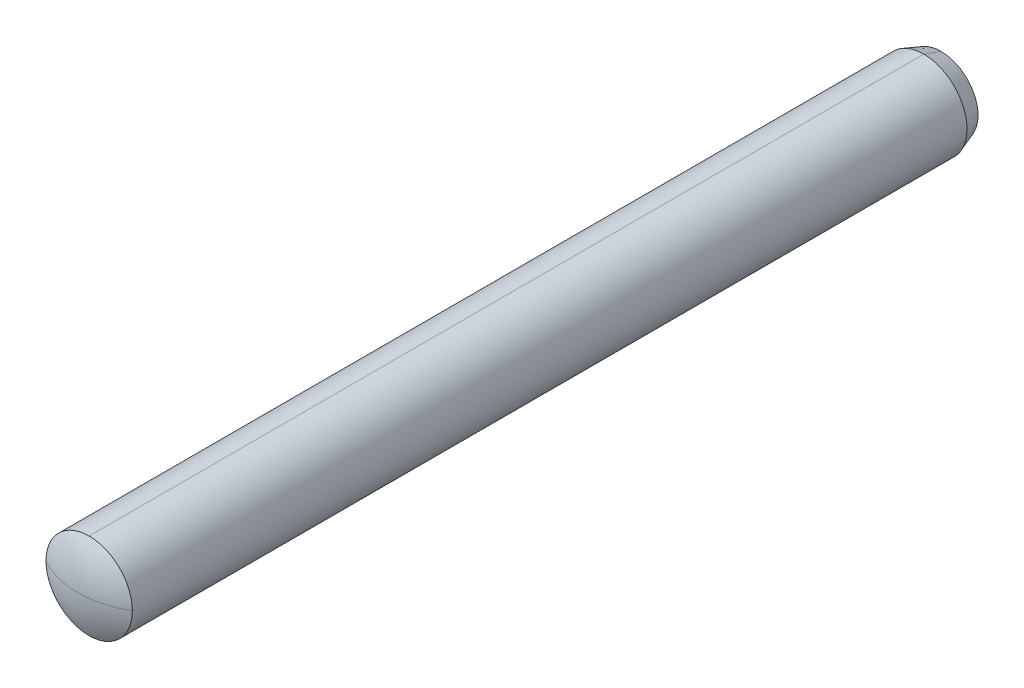
ISO-10303-21;
HEADER;
FILE_DESCRIPTION(('STEP AP214'),'2;1');
FILE_NAME('part.step','',(''),(''),'','','');
FILE_SCHEMA(('AUTOMOTIVE_DESIGN { 1 0 10303 214 1 1 1 1 }'));
ENDSEC;
DATA;
#1=APPLICATION_CONTEXT('core data for automotive mechanical design processes');
#2=APPLICATION_PROTOCOL_DEFINITION('international standard','automotive_design',2000,#1);
#3=PRODUCT_CONTEXT('',#1,'mechanical');
#4=PRODUCT('Part','Part','',(#3));
#5=PRODUCT_RELATED_PRODUCT_CATEGORY('part','',(#4));
#6=PRODUCT_DEFINITION_FORMATION('','',#4);
#7=PRODUCT_DEFINITION_CONTEXT('part definition',#1,'design');
#8=PRODUCT_DEFINITION('design','',#6,#7);
#9=PRODUCT_DEFINITION_SHAPE('','',#8);
#10=(LENGTH_UNIT() NAMED_UNIT(*) SI_UNIT(.MILLI.,.METRE.));
#11=(NAMED_UNIT(*) PLANE_ANGLE_UNIT() SI_UNIT($,.RADIAN.));
#12=(NAMED_UNIT(*) SI_UNIT($,.STERADIAN.) SOLID_ANGLE_UNIT());
#13=UNCERTAINTY_MEASURE_WITH_UNIT(LENGTH_MEASURE(1.E-05),#10,'distance_accuracy_value','');
#14=(GEOMETRIC_REPRESENTATION_CONTEXT(3) GLOBAL_UNCERTAINTY_ASSIGNED_CONTEXT((#13)) GLOBAL_UNIT_ASSIGNED_CONTEXT((#10,
#11,#12)) REPRESENTATION_CONTEXT('',''));
#15=CARTESIAN_POINT('',(0.,0.,0.));
#16=DIRECTION('',(0.,0.,1.));
#17=DIRECTION('',(1.,0.,0.));
#18=AXIS2_PLACEMENT_3D('',#15,#16,#17);
#19=CARTESIAN_POINT('',(0.,0.,7.2));
#20=DIRECTION('',(-1.,0.,0.));
#21=DIRECTION('',(0.,0.,1.));
#22=AXIS2_PLACEMENT_3D('',#19,#20,#21);
#23=SPHERICAL_SURFACE('',#22,0.8);
#24=CARTESIAN_POINT('',(0.,0.,7.2));
#25=DIRECTION('',(0.,-1.,0.));
#26=DIRECTION('',(0.,0.,1.));
#27=AXIS2_PLACEMENT_3D('',#24,#25,#26);
#28=CIRCLE('',#27,0.8);
#29=CARTESIAN_POINT('',(0.4,0.,7.89282032302755));
#30=VERTEX_POINT('',#29);
#31=CARTESIAN_POINT('',(-0.399999999999999,0.,7.89282032302755));
#32=VERTEX_POINT('',#31);
#33=EDGE_CURVE('E11',#30,#32,#28,.T.);
#34=ORIENTED_EDGE('',*,*,#33,.F.);
#35=CARTESIAN_POINT('',(0.,0.,7.89282032302755));
#36=DIRECTION('',(0.,0.,1.));
#37=DIRECTION('',(0.,1.,0.));
#38=AXIS2_PLACEMENT_3D('',#35,#36,#37);
#39=CIRCLE('',#38,0.4);
#40=CARTESIAN_POINT('',(0.,0.4,7.89282032302755));
#41=VERTEX_POINT('',#40);
#42=EDGE_CURVE('E24',#30,#41,#39,.T.);
#43=ORIENTED_EDGE('',*,*,#42,.T.);
#44=CARTESIAN_POINT('',(0.,0.,7.89282032302755));
#45=DIRECTION('',(0.,0.,1.));
#46=DIRECTION('',(0.,1.,0.));
#47=AXIS2_PLACEMENT_3D('',#44,#45,#46);
#48=CIRCLE('',#47,0.4);
#49=EDGE_CURVE('E89',#41,#32,#48,.T.);
#50=ORIENTED_EDGE('',*,*,#49,.T.);
#51=EDGE_LOOP('',(#34,#43,#50));
#52=FACE_BOUND('',#51,.T.);
#53=ADVANCED_FACE('F17',(#52),#23,.T.);
#54=CARTESIAN_POINT('',(0.,0.,4.02641016151378));
#55=DIRECTION('',(0.,0.,1.));
#56=DIRECTION('',(0.,1.,0.));
#57=AXIS2_PLACEMENT_3D('',#54,#55,#56);
#58=CYLINDRICAL_SURFACE('',#57,0.4);
#59=DIRECTION('',(0.,0.,1.));
#60=VECTOR('',#59,1.);
#61=CARTESIAN_POINT('',(0.,0.4,4.02641016151378));
#62=LINE('',#61,#60);
#63=CARTESIAN_POINT('',(0.,0.4,0.16));
#64=VERTEX_POINT('',#63);
#65=EDGE_CURVE('E86',#64,#41,#62,.T.);
#66=ORIENTED_EDGE('',*,*,#65,.F.);
#67=CARTESIAN_POINT('',(0.,0.,0.16));
#68=DIRECTION('',(0.,0.,1.));
#69=DIRECTION('',(0.,1.,0.));
#70=AXIS2_PLACEMENT_3D('',#67,#68,#69);
#71=CIRCLE('',#70,0.4);
#72=CARTESIAN_POINT('',(0.,-0.4,0.16));
#73=VERTEX_POINT('',#72);
#74=EDGE_CURVE('E84',#64,#73,#71,.T.);
#75=ORIENTED_EDGE('',*,*,#74,.T.);
#76=DIRECTION('',(0.,0.,-1.));
#77=VECTOR('',#76,1.);
#78=CARTESIAN_POINT('',(0.,-0.4,4.02641016151378));
#79=LINE('',#78,#77);
#80=CARTESIAN_POINT('',(0.,-0.4,7.89282032302755));
#81=VERTEX_POINT('',#80);
#82=EDGE_CURVE('E81',#81,#73,#79,.T.);
#83=ORIENTED_EDGE('',*,*,#82,.F.);
#84=CARTESIAN_POINT('',(0.,0.,7.89282032302755));
#85=DIRECTION('',(0.,0.,1.));
#86=DIRECTION('',(0.,1.,0.));
#87=AXIS2_PLACEMENT_3D('',#84,#85,#86);
#88=CIRCLE('',#87,0.4);
#89=EDGE_CURVE('E79',#32,#81,#88,.T.);
#90=ORIENTED_EDGE('',*,*,#89,.F.);
#91=ORIENTED_EDGE('',*,*,#49,.F.);
#92=EDGE_LOOP('',(#66,#75,#83,#90,#91));
#93=FACE_BOUND('',#92,.T.);
#94=ADVANCED_FACE('F95',(#93),#58,.T.);
#95=CARTESIAN_POINT('',(0.,0.,0.0800000000000001));
#96=DIRECTION('',(0.,0.,1.));
#97=DIRECTION('',(0.,1.,0.));
#98=AXIS2_PLACEMENT_3D('',#95,#96,#97);
#99=CONICAL_SURFACE('',#98,0.370882381258704,0.349065850398866);
#100=DIRECTION('',(0.,0.342020143325669,0.939692620785908));
#101=VECTOR('',#100,1.);
#102=CARTESIAN_POINT('',(0.,0.370882381258704,0.0800000000000001));
#103=LINE('',#102,#101);
#104=CARTESIAN_POINT('',(0.,0.341764762517408,0.));
#105=VERTEX_POINT('',#104);
#106=EDGE_CURVE('E61',#105,#64,#103,.T.);
#107=ORIENTED_EDGE('',*,*,#106,.F.);
#108=CARTESIAN_POINT('',(0.,0.,0.));
#109=DIRECTION('',(0.,0.,1.));
#110=DIRECTION('',(0.,1.,0.));
#111=AXIS2_PLACEMENT_3D('',#108,#109,#110);
#112=CIRCLE('',#111,0.341764762517408);
#113=CARTESIAN_POINT('',(0.,-0.341764762517408,0.));
#114=VERTEX_POINT('',#113);
#115=EDGE_CURVE('E54',#105,#114,#112,.T.);
#116=ORIENTED_EDGE('',*,*,#115,.T.);
#117=DIRECTION('',(0.,0.342020143325669,-0.939692620785908));
#118=VECTOR('',#117,1.);
#119=CARTESIAN_POINT('',(0.,-0.370882381258704,0.0800000000000001));
#120=LINE('',#119,#118);
#121=EDGE_CURVE('E58',#73,#114,#120,.T.);
#122=ORIENTED_EDGE('',*,*,#121,.F.);
#123=ORIENTED_EDGE('',*,*,#74,.F.);
#124=EDGE_LOOP('',(#107,#116,#122,#123));
#125=FACE_BOUND('',#124,.T.);
#126=ADVANCED_FACE('F56',(#125),#99,.T.);
#127=CARTESIAN_POINT('',(0.,0.170882381258704,0.));
#128=DIRECTION('',(0.,0.,-1.));
#129=DIRECTION('',(0.,-1.,0.));
#130=AXIS2_PLACEMENT_3D('',#127,#128,#129);
#131=PLANE('',#130);
#132=ORIENTED_EDGE('',*,*,#115,.F.);
#133=CARTESIAN_POINT('',(0.,0.,0.));
#134=DIRECTION('',(0.,0.,1.));
#135=DIRECTION('',(0.,1.,0.));
#136=AXIS2_PLACEMENT_3D('',#133,#134,#135);
#137=CIRCLE('',#136,0.341764762517408);
#138=EDGE_CURVE('E68',#114,#105,#137,.T.);
#139=ORIENTED_EDGE('',*,*,#138,.F.);
#140=EDGE_LOOP('',(#132,#139));
#141=FACE_BOUND('',#140,.T.);
#142=ADVANCED_FACE('F72',(#141),#131,.T.);
#143=CARTESIAN_POINT('',(0.,0.,0.0800000000000001));
#144=DIRECTION('',(0.,0.,1.));
#145=DIRECTION('',(0.,1.,0.));
#146=AXIS2_PLACEMENT_3D('',#143,#144,#145);
#147=CONICAL_SURFACE('',#146,0.370882381258704,0.349065850398866);
#148=ORIENTED_EDGE('',*,*,#106,.T.);
#149=CARTESIAN_POINT('',(0.,0.,0.16));
#150=DIRECTION('',(0.,0.,1.));
#151=DIRECTION('',(0.,1.,0.));
#152=AXIS2_PLACEMENT_3D('',#149,#150,#151);
#153=CIRCLE('',#152,0.4);
#154=EDGE_CURVE('E70',#73,#64,#153,.T.);
#155=ORIENTED_EDGE('',*,*,#154,.F.);
#156=ORIENTED_EDGE('',*,*,#121,.T.);
#157=ORIENTED_EDGE('',*,*,#138,.T.);
#158=EDGE_LOOP('',(#148,#155,#156,#157));
#159=FACE_BOUND('',#158,.T.);
#160=ADVANCED_FACE('F67',(#159),#147,.T.);
#161=CARTESIAN_POINT('',(0.,0.,4.02641016151378));
#162=DIRECTION('',(0.,0.,1.));
#163=DIRECTION('',(0.,1.,0.));
#164=AXIS2_PLACEMENT_3D('',#161,#162,#163);
#165=CYLINDRICAL_SURFACE('',#164,0.4);
#166=ORIENTED_EDGE('',*,*,#65,.T.);
#167=ORIENTED_EDGE('',*,*,#42,.F.);
#168=CARTESIAN_POINT('',(0.,0.,7.89282032302755));
#169=DIRECTION('',(0.,0.,1.));
#170=DIRECTION('',(0.,1.,0.));
#171=AXIS2_PLACEMENT_3D('',#168,#169,#170);
#172=CIRCLE('',#171,0.4);
#173=EDGE_CURVE('E74',#81,#30,#172,.T.);
#174=ORIENTED_EDGE('',*,*,#173,.F.);
#175=ORIENTED_EDGE('',*,*,#82,.T.);
#176=ORIENTED_EDGE('',*,*,#154,.T.);
#177=EDGE_LOOP('',(#166,#167,#174,#175,#176));
#178=FACE_BOUND('',#177,.T.);
#179=ADVANCED_FACE('F96',(#178),#165,.T.);
#180=CARTESIAN_POINT('',(0.,0.,7.2));
#181=DIRECTION('',(-1.,0.,0.));
#182=DIRECTION('',(0.,0.,1.));
#183=AXIS2_PLACEMENT_3D('',#180,#181,#182);
#184=SPHERICAL_SURFACE('',#183,0.8);
#185=ORIENTED_EDGE('',*,*,#33,.T.);
#186=ORIENTED_EDGE('',*,*,#89,.T.);
#187=ORIENTED_EDGE('',*,*,#173,.T.);
#188=EDGE_LOOP('',(#185,#186,#187));
#189=FACE_BOUND('',#188,.T.);
#190=ADVANCED_FACE('F97',(#189),#184,.T.);
#191=CLOSED_SHELL('',(#53,#94,#126,#142,#160,#179,#190));
#192=MANIFOLD_SOLID_BREP('B1',#191);
#193=ADVANCED_BREP_SHAPE_REPRESENTATION('',(#18,#192),#14);
#194=SHAPE_DEFINITION_REPRESENTATION(#9,#193);
ENDSEC;
END-ISO-10303-21;
